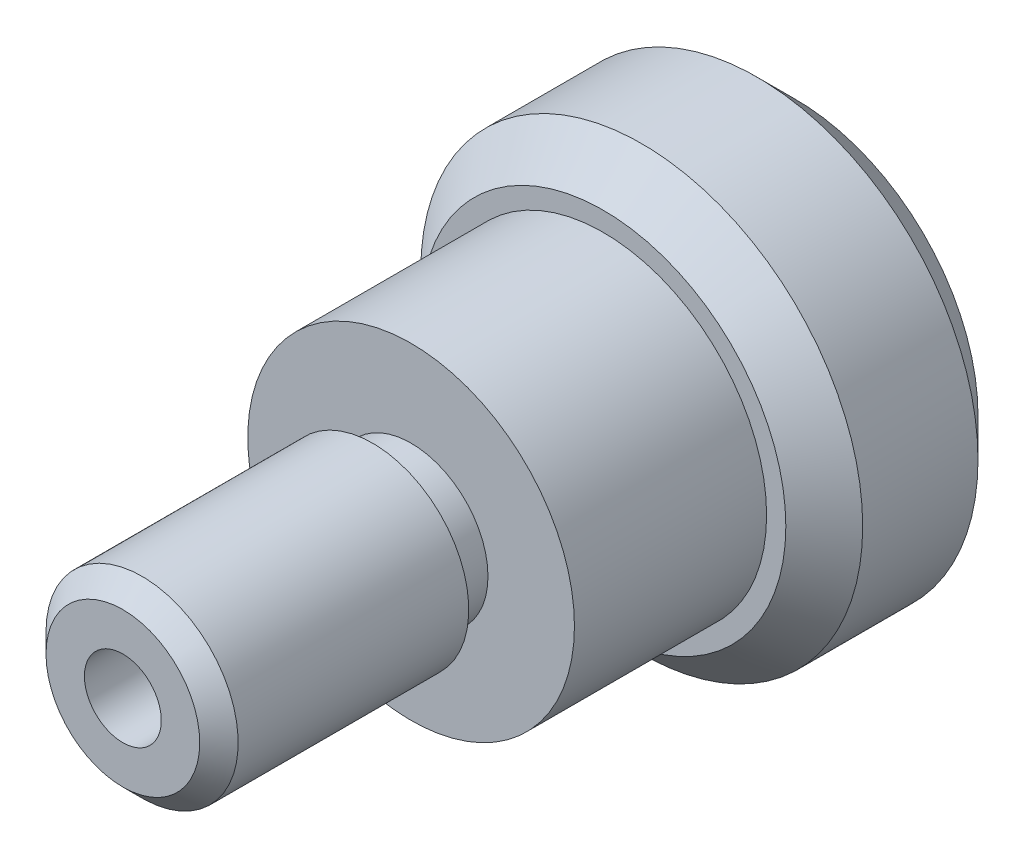
ISO-10303-21;
HEADER;
FILE_DESCRIPTION(('STEP AP214'),'2;1');
FILE_NAME('part.step','',(''),(''),'','','');
FILE_SCHEMA(('AUTOMOTIVE_DESIGN { 1 0 10303 214 1 1 1 1 }'));
ENDSEC;
DATA;
#1=APPLICATION_CONTEXT('core data for automotive mechanical design processes');
#2=APPLICATION_PROTOCOL_DEFINITION('international standard','automotive_design',2000,#1);
#3=PRODUCT_CONTEXT('',#1,'mechanical');
#4=PRODUCT('Part','Part','',(#3));
#5=PRODUCT_RELATED_PRODUCT_CATEGORY('part','',(#4));
#6=PRODUCT_DEFINITION_FORMATION('','',#4);
#7=PRODUCT_DEFINITION_CONTEXT('part definition',#1,'design');
#8=PRODUCT_DEFINITION('design','',#6,#7);
#9=PRODUCT_DEFINITION_SHAPE('','',#8);
#10=(LENGTH_UNIT() NAMED_UNIT(*) SI_UNIT(.MILLI.,.METRE.));
#11=(NAMED_UNIT(*) PLANE_ANGLE_UNIT() SI_UNIT($,.RADIAN.));
#12=(NAMED_UNIT(*) SI_UNIT($,.STERADIAN.) SOLID_ANGLE_UNIT());
#13=UNCERTAINTY_MEASURE_WITH_UNIT(LENGTH_MEASURE(1.E-05),#10,'distance_accuracy_value','');
#14=(GEOMETRIC_REPRESENTATION_CONTEXT(3) GLOBAL_UNCERTAINTY_ASSIGNED_CONTEXT((#13)) GLOBAL_UNIT_ASSIGNED_CONTEXT((#10,
#11,#12)) REPRESENTATION_CONTEXT('',''));
#15=CARTESIAN_POINT('',(0.,0.,0.));
#16=DIRECTION('',(0.,0.,1.));
#17=DIRECTION('',(1.,0.,0.));
#18=AXIS2_PLACEMENT_3D('',#15,#16,#17);
#19=CARTESIAN_POINT('',(0.,0.,35.));
#20=DIRECTION('',(0.,0.,1.));
#21=DIRECTION('',(1.,0.,0.));
#22=AXIS2_PLACEMENT_3D('',#19,#20,#21);
#23=PLANE('',#22);
#24=CARTESIAN_POINT('',(0.,0.,35.));
#25=DIRECTION('',(0.,0.,1.));
#26=DIRECTION('',(1.,0.,0.));
#27=AXIS2_PLACEMENT_3D('',#24,#25,#26);
#28=CIRCLE('',#27,4.00000000000002);
#29=CARTESIAN_POINT('',(4.00000000000002,0.,35.));
#30=VERTEX_POINT('',#29);
#31=EDGE_CURVE('E42',#30,#30,#28,.T.);
#32=ORIENTED_EDGE('',*,*,#31,.T.);
#33=EDGE_LOOP('',(#32));
#34=FACE_BOUND('',#33,.T.);
#35=CARTESIAN_POINT('',(0.,0.,35.));
#36=DIRECTION('',(0.,0.,-1.));
#37=DIRECTION('',(-1.,0.,0.));
#38=AXIS2_PLACEMENT_3D('',#35,#36,#37);
#39=CIRCLE('',#38,2.);
#40=CARTESIAN_POINT('',(-2.,0.,35.));
#41=VERTEX_POINT('',#40);
#42=EDGE_CURVE('E68',#41,#41,#39,.T.);
#43=ORIENTED_EDGE('',*,*,#42,.T.);
#44=EDGE_LOOP('',(#43));
#45=FACE_BOUND('',#44,.T.);
#46=ADVANCED_FACE('F34',(#34,#45),#23,.T.);
#47=CARTESIAN_POINT('',(0.,0.,20.));
#48=DIRECTION('',(0.,0.,1.));
#49=DIRECTION('',(1.,0.,0.));
#50=AXIS2_PLACEMENT_3D('',#47,#48,#49);
#51=PLANE('',#50);
#52=CARTESIAN_POINT('',(0.,0.,20.));
#53=DIRECTION('',(0.,0.,1.));
#54=DIRECTION('',(1.,0.,0.));
#55=AXIS2_PLACEMENT_3D('',#52,#53,#54);
#56=CIRCLE('',#55,8.5);
#57=CARTESIAN_POINT('',(8.5,0.,20.));
#58=VERTEX_POINT('',#57);
#59=EDGE_CURVE('E113',#58,#58,#56,.T.);
#60=ORIENTED_EDGE('',*,*,#59,.T.);
#61=EDGE_LOOP('',(#60));
#62=FACE_BOUND('',#61,.T.);
#63=CARTESIAN_POINT('',(0.,0.,20.));
#64=DIRECTION('',(0.,0.,1.));
#65=DIRECTION('',(1.,0.,0.));
#66=AXIS2_PLACEMENT_3D('',#63,#64,#65);
#67=CIRCLE('',#66,4.);
#68=CARTESIAN_POINT('',(4.,0.,20.));
#69=VERTEX_POINT('',#68);
#70=EDGE_CURVE('E116',#69,#69,#67,.T.);
#71=ORIENTED_EDGE('',*,*,#70,.F.);
#72=EDGE_LOOP('',(#71));
#73=FACE_BOUND('',#72,.T.);
#74=ADVANCED_FACE('F90',(#62,#73),#51,.T.);
#75=CARTESIAN_POINT('',(0.,0.,10.));
#76=DIRECTION('',(0.,0.,1.));
#77=DIRECTION('',(1.,0.,0.));
#78=AXIS2_PLACEMENT_3D('',#75,#76,#77);
#79=PLANE('',#78);
#80=CARTESIAN_POINT('',(0.,0.,10.));
#81=DIRECTION('',(0.,0.,1.));
#82=DIRECTION('',(1.,0.,0.));
#83=AXIS2_PLACEMENT_3D('',#80,#81,#82);
#84=CIRCLE('',#83,9.49999999999999);
#85=CARTESIAN_POINT('',(9.49999999999999,0.,10.));
#86=VERTEX_POINT('',#85);
#87=EDGE_CURVE('E131',#86,#86,#84,.T.);
#88=ORIENTED_EDGE('',*,*,#87,.T.);
#89=EDGE_LOOP('',(#88));
#90=FACE_BOUND('',#89,.T.);
#91=CARTESIAN_POINT('',(0.,0.,10.));
#92=DIRECTION('',(0.,0.,1.));
#93=DIRECTION('',(1.,0.,0.));
#94=AXIS2_PLACEMENT_3D('',#91,#92,#93);
#95=CIRCLE('',#94,8.5);
#96=CARTESIAN_POINT('',(8.5,0.,10.));
#97=VERTEX_POINT('',#96);
#98=EDGE_CURVE('E122',#97,#97,#95,.T.);
#99=ORIENTED_EDGE('',*,*,#98,.F.);
#100=EDGE_LOOP('',(#99));
#101=FACE_BOUND('',#100,.T.);
#102=ADVANCED_FACE('F103',(#90,#101),#79,.T.);
#103=CARTESIAN_POINT('',(0.,0.,10.));
#104=DIRECTION('',(0.,0.,-1.));
#105=DIRECTION('',(-1.,0.,0.));
#106=AXIS2_PLACEMENT_3D('',#103,#104,#105);
#107=CYLINDRICAL_SURFACE('',#106,11.5);
#108=CARTESIAN_POINT('',(0.,0.,7.99999999999999));
#109=DIRECTION('',(0.,0.,1.));
#110=DIRECTION('',(1.,0.,0.));
#111=AXIS2_PLACEMENT_3D('',#108,#109,#110);
#112=CIRCLE('',#111,11.5);
#113=CARTESIAN_POINT('',(11.5,0.,7.99999999999999));
#114=VERTEX_POINT('',#113);
#115=EDGE_CURVE('E137',#114,#114,#112,.F.);
#116=ORIENTED_EDGE('',*,*,#115,.T.);
#117=EDGE_LOOP('',(#116));
#118=FACE_BOUND('',#117,.T.);
#119=CARTESIAN_POINT('',(0.,0.,2.00000000000001));
#120=DIRECTION('',(0.,0.,1.));
#121=DIRECTION('',(1.,0.,0.));
#122=AXIS2_PLACEMENT_3D('',#119,#120,#121);
#123=CIRCLE('',#122,11.5);
#124=CARTESIAN_POINT('',(11.5,0.,2.00000000000001));
#125=VERTEX_POINT('',#124);
#126=EDGE_CURVE('E134',#125,#125,#123,.T.);
#127=ORIENTED_EDGE('',*,*,#126,.T.);
#128=EDGE_LOOP('',(#127));
#129=FACE_BOUND('',#128,.T.);
#130=ADVANCED_FACE('F108',(#118,#129),#107,.T.);
#131=CARTESIAN_POINT('',(0.,0.,0.));
#132=DIRECTION('',(0.,0.,1.));
#133=DIRECTION('',(1.,0.,0.));
#134=AXIS2_PLACEMENT_3D('',#131,#132,#133);
#135=PLANE('',#134);
#136=CARTESIAN_POINT('',(0.,0.,0.));
#137=DIRECTION('',(0.,0.,1.));
#138=DIRECTION('',(1.,0.,0.));
#139=AXIS2_PLACEMENT_3D('',#136,#137,#138);
#140=CIRCLE('',#139,9.49999999999999);
#141=CARTESIAN_POINT('',(9.49999999999999,0.,0.));
#142=VERTEX_POINT('',#141);
#143=EDGE_CURVE('E140',#142,#142,#140,.F.);
#144=ORIENTED_EDGE('',*,*,#143,.T.);
#145=EDGE_LOOP('',(#144));
#146=FACE_BOUND('',#145,.T.);
#147=ADVANCED_FACE('F168',(#146),#135,.F.);
#148=CARTESIAN_POINT('',(0.,0.,20.));
#149=DIRECTION('',(0.,0.,-1.));
#150=DIRECTION('',(-1.,0.,0.));
#151=AXIS2_PLACEMENT_3D('',#148,#149,#150);
#152=CYLINDRICAL_SURFACE('',#151,8.5);
#153=CARTESIAN_POINT('',(-8.5,0.,17.));
#154=CARTESIAN_POINT('',(-8.49999801750481,-0.110707222526125,16.9999965435594));
#155=CARTESIAN_POINT('',(-8.49781540060716,-0.221454521072923,16.9907769473835));
#156=CARTESIAN_POINT('',(-8.48931965269305,-0.439788787350877,16.95418912396));
#157=CARTESIAN_POINT('',(-8.48300388462288,-0.547373691572941,16.9268093098887));
#158=CARTESIAN_POINT('',(-8.4669430800191,-0.756197517316249,16.8548176046271));
#159=CARTESIAN_POINT('',(-8.45720190485864,-0.857443433845185,16.8102251113391));
#160=CARTESIAN_POINT('',(-8.43533444577621,-1.0510155369327,16.70513893196));
#161=CARTESIAN_POINT('',(-8.42320814931182,-1.14334167658186,16.6446451622497));
#162=CARTESIAN_POINT('',(-8.39764327718341,-1.31815374652725,16.5082968847689));
#163=CARTESIAN_POINT('',(-8.38418634599685,-1.40045211681902,16.4322053312429));
#164=CARTESIAN_POINT('',(-8.3576023587247,-1.55124417062838,16.2673296337114));
#165=CARTESIAN_POINT('',(-8.34447533602387,-1.61973646193728,16.1785442111942));
#166=CARTESIAN_POINT('',(-8.31985447393301,-1.74182760532486,15.9893785386005));
#167=CARTESIAN_POINT('',(-8.30838404762359,-1.79522157802198,15.8888627334876));
#168=CARTESIAN_POINT('',(-8.28864082978449,-1.88428453492285,15.6799695603254));
#169=CARTESIAN_POINT('',(-8.28036759056153,-1.91995600096022,15.5715932954807));
#170=CARTESIAN_POINT('',(-8.2681433438507,-1.97193118009561,15.3521048804647));
#171=CARTESIAN_POINT('',(-8.26411772364193,-1.98856967737172,15.2410762560102));
#172=CARTESIAN_POINT('',(-8.26062082026474,-2.00304855484246,15.0177362036971));
#173=CARTESIAN_POINT('',(-8.26114888525169,-2.00089162553842,14.9054249617393));
#174=CARTESIAN_POINT('',(-8.26663238190337,-1.97810910167244,14.6852356681787));
#175=CARTESIAN_POINT('',(-8.27149336028225,-1.95787749619193,14.5773141371122));
#176=CARTESIAN_POINT('',(-8.28494503088792,-1.90014632726016,14.3664414887104));
#177=CARTESIAN_POINT('',(-8.29353596158136,-1.86264565973852,14.263490689636));
#178=CARTESIAN_POINT('',(-8.31356933146056,-1.77109260203966,14.0644006849992));
#179=CARTESIAN_POINT('',(-8.32503693669168,-1.71689311623115,13.9683317607224));
#180=CARTESIAN_POINT('',(-8.3495167535664,-1.59358407474821,13.7865088308527));
#181=CARTESIAN_POINT('',(-8.36252920661224,-1.52447218743741,13.7007564415764));
#182=CARTESIAN_POINT('',(-8.38903394638453,-1.37123756634556,13.5397377092539));
#183=CARTESIAN_POINT('',(-8.40253007115743,-1.28678108396335,13.4647892544237));
#184=CARTESIAN_POINT('',(-8.42818503228671,-1.10634012247957,13.3300631840312));
#185=CARTESIAN_POINT('',(-8.4403438364415,-1.01035536590296,13.2702859337337));
#186=CARTESIAN_POINT('',(-8.46200394642273,-0.809160897355915,13.1675011797663));
#187=CARTESIAN_POINT('',(-8.47149782003105,-0.703926440039182,13.1245404467203));
#188=CARTESIAN_POINT('',(-8.48670384958574,-0.487457687798596,13.057003862603));
#189=CARTESIAN_POINT('',(-8.49241664415731,-0.376224409511195,13.0324249067537));
#190=CARTESIAN_POINT('',(-8.49932407764157,-0.153637663571889,13.0028237974332));
#191=CARTESIAN_POINT('',(-8.50061885597204,-0.0423448759149314,12.9973681137337));
#192=CARTESIAN_POINT('',(-8.49882735084224,0.179562447634434,13.0049861618048));
#193=CARTESIAN_POINT('',(-8.49574141406895,0.290177036503305,13.0180584272852));
#194=CARTESIAN_POINT('',(-8.4855989282765,0.506115547274072,13.0620027867293));
#195=CARTESIAN_POINT('',(-8.47859417913237,0.611489350752372,13.0926427944786));
#196=CARTESIAN_POINT('',(-8.46140046160523,0.815599145285606,13.1705914348227));
#197=CARTESIAN_POINT('',(-8.45121119444604,0.91433451245605,13.2179016314921));
#198=CARTESIAN_POINT('',(-8.42853504656538,1.10412269234789,13.3287183409279));
#199=CARTESIAN_POINT('',(-8.41601380204275,1.19502614893552,13.3924734508101));
#200=CARTESIAN_POINT('',(-8.39012409804059,1.36499902472578,13.5340478830376));
#201=CARTESIAN_POINT('',(-8.37675551017066,1.44406664441852,13.6118693400551));
#202=CARTESIAN_POINT('',(-8.35032432460353,1.58987521562228,13.7813697659225));
#203=CARTESIAN_POINT('',(-8.337274528673,1.65631382120375,13.8733112150152));
#204=CARTESIAN_POINT('',(-8.31328366919846,1.77281313863698,14.0672985127205));
#205=CARTESIAN_POINT('',(-8.30234251141978,1.82287458245114,14.1693439094809));
#206=CARTESIAN_POINT('',(-8.28392155078471,1.90483844015696,14.3800851322557));
#207=CARTESIAN_POINT('',(-8.27642150929975,1.936847290954,14.4887377025626));
#208=CARTESIAN_POINT('',(-8.26570319885666,1.98209519216249,14.7100820330485));
#209=CARTESIAN_POINT('',(-8.26248411864936,1.99533779883918,14.8227730237824));
#210=CARTESIAN_POINT('',(-8.26074892411982,2.00250786658812,15.0459329676756));
#211=CARTESIAN_POINT('',(-8.26211563101112,1.99691656853303,15.1563858107564));
#212=CARTESIAN_POINT('',(-8.26912996315445,1.96766652984528,15.3747270360829));
#213=CARTESIAN_POINT('',(-8.27477752057995,1.94400807547166,15.4826154589317));
#214=CARTESIAN_POINT('',(-8.28965579164934,1.87954382970522,15.6923105225665));
#215=CARTESIAN_POINT('',(-8.29886967522321,1.83881850605662,15.794143175447));
#216=CARTESIAN_POINT('',(-8.31984668167287,1.74144219098133,15.9895982133633));
#217=CARTESIAN_POINT('',(-8.33161011669299,1.68478924926668,16.0832195911107));
#218=CARTESIAN_POINT('',(-8.35670265527952,1.55561482360098,16.2619430585988));
#219=CARTESIAN_POINT('',(-8.37006180674132,1.4827549558821,16.3467964038323));
#220=CARTESIAN_POINT('',(-8.3966506561662,1.32390732881552,16.5032293540248));
#221=CARTESIAN_POINT('',(-8.40988032313166,1.23791650403864,16.5748058508324));
#222=CARTESIAN_POINT('',(-8.43496426083158,1.05363595816286,16.7037289322992));
#223=CARTESIAN_POINT('',(-8.44679396805159,0.955175905199518,16.7608371450185));
#224=CARTESIAN_POINT('',(-8.4674927014593,0.749789351513637,16.8576008466621));
#225=CARTESIAN_POINT('',(-8.47636402617268,0.642869503952002,16.8972698926713));
#226=CARTESIAN_POINT('',(-8.48870155772743,0.446656582230612,16.9515603730731));
#227=CARTESIAN_POINT('',(-8.49291078599891,0.358363661577135,16.9696882671158));
#228=CARTESIAN_POINT('',(-8.49856073191377,0.180055929660538,16.9939091322044));
#229=CARTESIAN_POINT('',(-8.5000016124177,0.0900412200041038,17.0000028112179));
#230=CARTESIAN_POINT('',(-8.5,0.,17.));
#231=B_SPLINE_CURVE_WITH_KNOTS('',3,(#153,#154,#155,#156,#157,#158,#159,#160,#161,#162,#163,
#164,#165,#166,#167,#168,#169,#170,#171,#172,#173,#174,#175,#176,#177,#178,#179,#180,#181,#182,
#183,#184,#185,#186,#187,#188,#189,#190,#191,#192,#193,#194,#195,#196,#197,#198,#199,#200,#201,
#202,#203,#204,#205,#206,#207,#208,#209,#210,#211,#212,#213,#214,#215,#216,#217,#218,#219,#220,
#221,#222,#223,#224,#225,#226,#227,#228,#229,#230),.UNSPECIFIED.,.T.,.F.,(4,2,2,2,2,2,2,2,2,2,2,
2,2,2,2,2,2,2,2,2,2,2,2,2,2,2,2,2,2,2,2,2,2,2,2,2,2,2,4),(0.,0.33179188856896,0.663795675313148,
0.995426396224181,1.32705886109823,1.66416482514813,2.00130476606585,2.34282124715151,
2.68428988928473,3.01965509679603,3.35497229870821,3.68315396602227,4.0113566180301,
4.34253723635987,4.67376967418079,5.0133309031367,5.35290030665979,5.69340753264886,
6.03385723219515,6.36653706536537,6.69919057193507,7.02754747309658,7.3559351904389,
7.68961218148233,8.02333985305755,8.36425908086049,8.70516306950514,9.0440355159349,
9.3828437363253,9.71306113426889,10.0432733003012,10.3719457765065,10.7006585151894,
11.0370154300388,11.3734509879818,11.7151138135869,12.0565105612022,12.3263818797879,
12.5962373214883),.UNSPECIFIED.);
#232=CARTESIAN_POINT('',(-8.5,0.,17.));
#233=VERTEX_POINT('',#232);
#234=EDGE_CURVE('E65',#233,#233,#231,.T.);
#235=ORIENTED_EDGE('',*,*,#234,.T.);
#236=EDGE_LOOP('',(#235));
#237=FACE_BOUND('',#236,.T.);
#238=ORIENTED_EDGE('',*,*,#59,.F.);
#239=EDGE_LOOP('',(#238));
#240=FACE_BOUND('',#239,.T.);
#241=ORIENTED_EDGE('',*,*,#98,.T.);
#242=EDGE_LOOP('',(#241));
#243=FACE_BOUND('',#242,.T.);
#244=ADVANCED_FACE('F76',(#237,#240,#243),#152,.T.);
#245=CARTESIAN_POINT('',(0.,0.,22.));
#246=DIRECTION('',(0.,0.,-1.));
#247=DIRECTION('',(-1.,0.,0.));
#248=AXIS2_PLACEMENT_3D('',#245,#246,#247);
#249=CYLINDRICAL_SURFACE('',#248,4.);
#250=CARTESIAN_POINT('',(0.,0.,22.));
#251=DIRECTION('',(0.,0.,1.));
#252=DIRECTION('',(1.,0.,0.));
#253=AXIS2_PLACEMENT_3D('',#250,#251,#252);
#254=CIRCLE('',#253,4.);
#255=CARTESIAN_POINT('',(4.,0.,22.));
#256=VERTEX_POINT('',#255);
#257=EDGE_CURVE('E118',#256,#256,#254,.T.);
#258=ORIENTED_EDGE('',*,*,#257,.F.);
#259=EDGE_LOOP('',(#258));
#260=FACE_BOUND('',#259,.T.);
#261=ORIENTED_EDGE('',*,*,#70,.T.);
#262=EDGE_LOOP('',(#261));
#263=FACE_BOUND('',#262,.T.);
#264=ADVANCED_FACE('F95',(#260,#263),#249,.T.);
#265=CARTESIAN_POINT('',(0.,0.,22.));
#266=DIRECTION('',(0.,0.,1.));
#267=DIRECTION('',(1.,0.,0.));
#268=AXIS2_PLACEMENT_3D('',#265,#266,#267);
#269=PLANE('',#268);
#270=CARTESIAN_POINT('',(0.,0.,22.));
#271=DIRECTION('',(0.,0.,1.));
#272=DIRECTION('',(1.,0.,0.));
#273=AXIS2_PLACEMENT_3D('',#270,#271,#272);
#274=CIRCLE('',#273,5.);
#275=CARTESIAN_POINT('',(-5.,0.,22.));
#276=VERTEX_POINT('',#275);
#277=EDGE_CURVE('E119',#276,#276,#274,.T.);
#278=ORIENTED_EDGE('',*,*,#277,.F.);
#279=EDGE_LOOP('',(#278));
#280=FACE_BOUND('',#279,.T.);
#281=ORIENTED_EDGE('',*,*,#257,.T.);
#282=EDGE_LOOP('',(#281));
#283=FACE_BOUND('',#282,.T.);
#284=ADVANCED_FACE('F92',(#280,#283),#269,.F.);
#285=CARTESIAN_POINT('',(0.,0.,35.));
#286=DIRECTION('',(0.,0.,-1.));
#287=DIRECTION('',(-1.,0.,0.));
#288=AXIS2_PLACEMENT_3D('',#285,#286,#287);
#289=CYLINDRICAL_SURFACE('',#288,5.);
#290=CARTESIAN_POINT('',(0.,0.,34.));
#291=DIRECTION('',(0.,0.,1.));
#292=DIRECTION('',(1.,0.,0.));
#293=AXIS2_PLACEMENT_3D('',#290,#291,#292);
#294=CIRCLE('',#293,5.);
#295=CARTESIAN_POINT('',(-5.,0.,34.));
#296=VERTEX_POINT('',#295);
#297=EDGE_CURVE('E11',#296,#296,#294,.F.);
#298=CARTESIAN_POINT('',(-5.,0.,34.));
#299=CARTESIAN_POINT('',(-5.,0.,33.875));
#300=CARTESIAN_POINT('',(-5.,0.,33.75));
#301=CARTESIAN_POINT('',(-5.,0.,33.5));
#302=CARTESIAN_POINT('',(-5.,0.,33.375));
#303=CARTESIAN_POINT('',(-5.,0.,33.125));
#304=CARTESIAN_POINT('',(-5.,0.,33.));
#305=CARTESIAN_POINT('',(-5.,0.,32.75));
#306=CARTESIAN_POINT('',(-5.,0.,32.625));
#307=CARTESIAN_POINT('',(-5.,0.,32.375));
#308=CARTESIAN_POINT('',(-5.,0.,32.25));
#309=CARTESIAN_POINT('',(-5.,0.,32.));
#310=CARTESIAN_POINT('',(-5.,0.,31.875));
#311=CARTESIAN_POINT('',(-5.,0.,31.625));
#312=CARTESIAN_POINT('',(-5.,0.,31.5));
#313=CARTESIAN_POINT('',(-5.,0.,31.25));
#314=CARTESIAN_POINT('',(-5.,0.,31.125));
#315=CARTESIAN_POINT('',(-5.,0.,30.875));
#316=CARTESIAN_POINT('',(-5.,0.,30.75));
#317=CARTESIAN_POINT('',(-5.,0.,30.5));
#318=CARTESIAN_POINT('',(-5.,0.,30.375));
#319=CARTESIAN_POINT('',(-5.,0.,30.125));
#320=CARTESIAN_POINT('',(-5.,0.,30.));
#321=CARTESIAN_POINT('',(-5.,0.,29.75));
#322=CARTESIAN_POINT('',(-5.,0.,29.625));
#323=CARTESIAN_POINT('',(-5.,0.,29.375));
#324=CARTESIAN_POINT('',(-5.,0.,29.25));
#325=CARTESIAN_POINT('',(-5.,0.,29.));
#326=CARTESIAN_POINT('',(-5.,0.,28.875));
#327=CARTESIAN_POINT('',(-5.,0.,28.625));
#328=CARTESIAN_POINT('',(-5.,0.,28.5));
#329=CARTESIAN_POINT('',(-5.,0.,28.25));
#330=CARTESIAN_POINT('',(-5.,0.,28.125));
#331=CARTESIAN_POINT('',(-5.,0.,27.875));
#332=CARTESIAN_POINT('',(-5.,0.,27.75));
#333=CARTESIAN_POINT('',(-5.,0.,27.5));
#334=CARTESIAN_POINT('',(-5.,0.,27.375));
#335=CARTESIAN_POINT('',(-5.,0.,27.125));
#336=CARTESIAN_POINT('',(-5.,0.,27.));
#337=CARTESIAN_POINT('',(-5.,0.,26.75));
#338=CARTESIAN_POINT('',(-5.,0.,26.625));
#339=CARTESIAN_POINT('',(-5.,0.,26.375));
#340=CARTESIAN_POINT('',(-5.,0.,26.25));
#341=CARTESIAN_POINT('',(-5.,0.,26.));
#342=CARTESIAN_POINT('',(-5.,0.,25.875));
#343=CARTESIAN_POINT('',(-5.,0.,25.625));
#344=CARTESIAN_POINT('',(-5.,0.,25.5));
#345=CARTESIAN_POINT('',(-5.,0.,25.25));
#346=CARTESIAN_POINT('',(-5.,0.,25.125));
#347=CARTESIAN_POINT('',(-5.,0.,24.875));
#348=CARTESIAN_POINT('',(-5.,0.,24.75));
#349=CARTESIAN_POINT('',(-5.,0.,24.5));
#350=CARTESIAN_POINT('',(-5.,0.,24.375));
#351=CARTESIAN_POINT('',(-5.,0.,24.125));
#352=CARTESIAN_POINT('',(-5.,0.,24.));
#353=CARTESIAN_POINT('',(-5.,0.,23.75));
#354=CARTESIAN_POINT('',(-5.,0.,23.625));
#355=CARTESIAN_POINT('',(-5.,0.,23.375));
#356=CARTESIAN_POINT('',(-5.,0.,23.25));
#357=CARTESIAN_POINT('',(-5.,0.,23.));
#358=CARTESIAN_POINT('',(-5.,0.,22.875));
#359=CARTESIAN_POINT('',(-5.,0.,22.625));
#360=CARTESIAN_POINT('',(-5.,0.,22.5));
#361=CARTESIAN_POINT('',(-5.,0.,22.25));
#362=CARTESIAN_POINT('',(-5.,0.,22.125));
#363=CARTESIAN_POINT('',(-5.,0.,22.));
#364=B_SPLINE_CURVE_WITH_KNOTS('',3,(#298,#299,#300,#301,#302,#303,#304,#305,#306,#307,#308,
#309,#310,#311,#312,#313,#314,#315,#316,#317,#318,#319,#320,#321,#322,#323,#324,#325,#326,#327,
#328,#329,#330,#331,#332,#333,#334,#335,#336,#337,#338,#339,#340,#341,#342,#343,#344,#345,#346,
#347,#348,#349,#350,#351,#352,#353,#354,#355,#356,#357,#358,#359,#360,#361,#362,#363),
.UNSPECIFIED.,.F.,.F.,(4,2,2,2,2,2,2,2,2,2,2,2,2,2,2,2,2,2,2,2,2,2,2,2,2,2,2,2,2,2,2,2,4),(0.,
0.375,0.750000000000001,1.125,1.5,1.875,2.25,2.625,3.00000000000001,3.37500000000001,
3.75000000000001,4.12500000000001,4.50000000000001,4.87500000000001,5.25000000000001,
5.62500000000001,6.00000000000001,6.37500000000001,6.75000000000001,7.12500000000001,
7.50000000000001,7.87500000000001,8.25000000000001,8.62500000000001,9.00000000000001,
9.37500000000001,9.75000000000001,10.125,10.5,10.875,11.25,11.625,12.),.UNSPECIFIED.);
#365=EDGE_CURVE('BSEAM86',#296,#276,#364,.T.);
#366=ORIENTED_EDGE('',*,*,#297,.T.);
#367=ORIENTED_EDGE('',*,*,#277,.T.);
#368=ORIENTED_EDGE('',*,*,#365,.T.);
#369=ORIENTED_EDGE('',*,*,#365,.F.);
#370=EDGE_LOOP('',(#366,#368,#367,#369));
#371=FACE_BOUND('',#370,.T.);
#372=ADVANCED_FACE('F86',(#371),#289,.T.);
#373=CARTESIAN_POINT('',(0.,0.,2.17007868836214));
#374=DIRECTION('',(0.,0.,-1.));
#375=DIRECTION('',(-1.,0.,0.));
#376=AXIS2_PLACEMENT_3D('',#373,#374,#375);
#377=CYLINDRICAL_SURFACE('',#376,2.);
#378=CARTESIAN_POINT('',(0.,0.,15.));
#379=DIRECTION('',(-0.707106781186547,0.,-0.707106781186547));
#380=DIRECTION('',(0.707106781186547,0.,-0.707106781186547));
#381=AXIS2_PLACEMENT_3D('',#378,#379,#380);
#382=ELLIPSE('',#381,2.82842712474619,2.);
#383=CARTESIAN_POINT('',(0.,2.,15.));
#384=VERTEX_POINT('',#383);
#385=CARTESIAN_POINT('',(0.,-2.,15.));
#386=VERTEX_POINT('',#385);
#387=EDGE_CURVE('E48',#384,#386,#382,.F.);
#388=ORIENTED_EDGE('',*,*,#387,.F.);
#389=CARTESIAN_POINT('',(0.,0.,15.));
#390=DIRECTION('',(0.707106781186547,0.,-0.707106781186547));
#391=DIRECTION('',(-0.707106781186547,0.,-0.707106781186547));
#392=AXIS2_PLACEMENT_3D('',#389,#390,#391);
#393=ELLIPSE('',#392,2.82842712474619,2.);
#394=EDGE_CURVE('E51',#386,#384,#393,.F.);
#395=ORIENTED_EDGE('',*,*,#394,.F.);
#396=EDGE_LOOP('',(#388,#395));
#397=FACE_BOUND('',#396,.T.);
#398=ORIENTED_EDGE('',*,*,#42,.F.);
#399=EDGE_LOOP('',(#398));
#400=FACE_BOUND('',#399,.T.);
#401=ADVANCED_FACE('F82',(#397,#400),#377,.F.);
#402=CARTESIAN_POINT('',(-16.3408637483329,0.,15.));
#403=DIRECTION('',(-1.,0.,0.));
#404=DIRECTION('',(0.,0.,1.));
#405=AXIS2_PLACEMENT_3D('',#402,#403,#404);
#406=CYLINDRICAL_SURFACE('',#405,2.);
#407=ORIENTED_EDGE('',*,*,#387,.T.);
#408=ORIENTED_EDGE('',*,*,#394,.T.);
#409=EDGE_LOOP('',(#407,#408));
#410=FACE_BOUND('',#409,.T.);
#411=CARTESIAN_POINT('',(3.5,0.,15.));
#412=DIRECTION('',(-1.,0.,0.));
#413=DIRECTION('',(0.,0.,1.));
#414=AXIS2_PLACEMENT_3D('',#411,#412,#413);
#415=CIRCLE('',#414,2.);
#416=CARTESIAN_POINT('',(3.5,0.,17.));
#417=VERTEX_POINT('',#416);
#418=EDGE_CURVE('E63',#417,#417,#415,.T.);
#419=ORIENTED_EDGE('',*,*,#418,.F.);
#420=EDGE_LOOP('',(#419));
#421=FACE_BOUND('',#420,.T.);
#422=ORIENTED_EDGE('',*,*,#234,.F.);
#423=EDGE_LOOP('',(#422));
#424=FACE_BOUND('',#423,.T.);
#425=ADVANCED_FACE('F59',(#410,#421,#424),#406,.F.);
#426=CARTESIAN_POINT('',(3.5,0.,15.));
#427=DIRECTION('',(-1.,0.,0.));
#428=DIRECTION('',(0.,0.,1.));
#429=AXIS2_PLACEMENT_3D('',#426,#427,#428);
#430=CONICAL_SURFACE('',#429,2.,1.0471975511966);
#431=CARTESIAN_POINT('',(4.65470053837925,0.,15.));
#432=VERTEX_POINT('',#431);
#433=VERTEX_LOOP('',#432);
#434=FACE_BOUND('',#433,.T.);
#435=ORIENTED_EDGE('',*,*,#418,.T.);
#436=EDGE_LOOP('',(#435));
#437=FACE_BOUND('',#436,.T.);
#438=ADVANCED_FACE('F55',(#434,#437),#430,.F.);
#439=CARTESIAN_POINT('',(0.,0.,10.));
#440=DIRECTION('',(0.,0.,-1.));
#441=DIRECTION('',(-1.,0.,0.));
#442=AXIS2_PLACEMENT_3D('',#439,#440,#441);
#443=CONICAL_SURFACE('',#442,9.49999999999999,0.785398163397448);
#444=ORIENTED_EDGE('',*,*,#115,.F.);
#445=EDGE_LOOP('',(#444));
#446=FACE_BOUND('',#445,.T.);
#447=ORIENTED_EDGE('',*,*,#87,.F.);
#448=EDGE_LOOP('',(#447));
#449=FACE_BOUND('',#448,.T.);
#450=ADVANCED_FACE('F58',(#446,#449),#443,.T.);
#451=CARTESIAN_POINT('',(0.,0.,2.00000000000001));
#452=DIRECTION('',(0.,0.,1.));
#453=DIRECTION('',(1.,0.,0.));
#454=AXIS2_PLACEMENT_3D('',#451,#452,#453);
#455=CONICAL_SURFACE('',#454,11.5,0.78539816339745);
#456=ORIENTED_EDGE('',*,*,#143,.F.);
#457=EDGE_LOOP('',(#456));
#458=FACE_BOUND('',#457,.T.);
#459=ORIENTED_EDGE('',*,*,#126,.F.);
#460=EDGE_LOOP('',(#459));
#461=FACE_BOUND('',#460,.T.);
#462=ADVANCED_FACE('F147',(#458,#461),#455,.T.);
#463=CARTESIAN_POINT('',(0.,0.,35.));
#464=DIRECTION('',(0.,0.,-1.));
#465=DIRECTION('',(-1.,0.,0.));
#466=AXIS2_PLACEMENT_3D('',#463,#464,#465);
#467=CONICAL_SURFACE('',#466,4.00000000000002,0.785398163397447);
#468=ORIENTED_EDGE('',*,*,#297,.F.);
#469=EDGE_LOOP('',(#468));
#470=FACE_BOUND('',#469,.T.);
#471=ORIENTED_EDGE('',*,*,#31,.F.);
#472=EDGE_LOOP('',(#471));
#473=FACE_BOUND('',#472,.T.);
#474=ADVANCED_FACE('F36',(#470,#473),#467,.T.);
#475=CLOSED_SHELL('',(#46,#74,#102,#130,#147,#244,#264,#284,#372,#401,#425,#438,#450,#462,#474));
#476=MANIFOLD_SOLID_BREP('B2',#475);
#477=ADVANCED_BREP_SHAPE_REPRESENTATION('',(#18,#476),#14);
#478=SHAPE_DEFINITION_REPRESENTATION(#9,#477);
ENDSEC;
END-ISO-10303-21;
